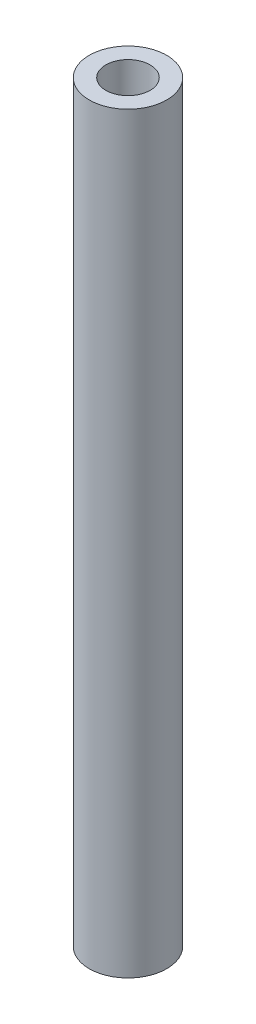
ISO-10303-21;
HEADER;
FILE_DESCRIPTION(('STEP AP214'),'2;1');
FILE_NAME('part.step','',(''),(''),'','','');
FILE_SCHEMA(('AUTOMOTIVE_DESIGN { 1 0 10303 214 1 1 1 1 }'));
ENDSEC;
DATA;
#1=APPLICATION_CONTEXT('core data for automotive mechanical design processes');
#2=APPLICATION_PROTOCOL_DEFINITION('international standard','automotive_design',2000,#1);
#3=PRODUCT_CONTEXT('',#1,'mechanical');
#4=PRODUCT('Part','Part','',(#3));
#5=PRODUCT_RELATED_PRODUCT_CATEGORY('part','',(#4));
#6=PRODUCT_DEFINITION_FORMATION('','',#4);
#7=PRODUCT_DEFINITION_CONTEXT('part definition',#1,'design');
#8=PRODUCT_DEFINITION('design','',#6,#7);
#9=PRODUCT_DEFINITION_SHAPE('','',#8);
#10=(LENGTH_UNIT() NAMED_UNIT(*) SI_UNIT(.MILLI.,.METRE.));
#11=(NAMED_UNIT(*) PLANE_ANGLE_UNIT() SI_UNIT($,.RADIAN.));
#12=(NAMED_UNIT(*) SI_UNIT($,.STERADIAN.) SOLID_ANGLE_UNIT());
#13=UNCERTAINTY_MEASURE_WITH_UNIT(LENGTH_MEASURE(1.E-05),#10,'distance_accuracy_value','');
#14=(GEOMETRIC_REPRESENTATION_CONTEXT(3) GLOBAL_UNCERTAINTY_ASSIGNED_CONTEXT((#13)) GLOBAL_UNIT_ASSIGNED_CONTEXT((#10,
#11,#12)) REPRESENTATION_CONTEXT('',''));
#15=CARTESIAN_POINT('',(0.,0.,0.));
#16=DIRECTION('',(0.,0.,1.));
#17=DIRECTION('',(1.,0.,0.));
#18=AXIS2_PLACEMENT_3D('',#15,#16,#17);
#19=CARTESIAN_POINT('',(0.,136.,0.));
#20=DIRECTION('',(0.,1.,0.));
#21=DIRECTION('',(0.,0.,1.));
#22=AXIS2_PLACEMENT_3D('',#19,#20,#21);
#23=PLANE('',#22);
#24=CARTESIAN_POINT('',(0.,136.,0.));
#25=DIRECTION('',(0.,1.,0.));
#26=DIRECTION('',(0.,0.,1.));
#27=AXIS2_PLACEMENT_3D('',#24,#25,#26);
#28=CIRCLE('',#27,7.);
#29=CARTESIAN_POINT('',(0.,136.,7.));
#30=VERTEX_POINT('',#29);
#31=EDGE_CURVE('E10',#30,#30,#28,.T.);
#32=ORIENTED_EDGE('',*,*,#31,.T.);
#33=EDGE_LOOP('',(#32));
#34=FACE_BOUND('',#33,.T.);
#35=CARTESIAN_POINT('',(0.,136.,0.));
#36=DIRECTION('',(0.,1.,0.));
#37=DIRECTION('',(0.,0.,1.));
#38=AXIS2_PLACEMENT_3D('',#35,#36,#37);
#39=CIRCLE('',#38,4.);
#40=CARTESIAN_POINT('',(0.,136.,4.));
#41=VERTEX_POINT('',#40);
#42=EDGE_CURVE('E44',#41,#41,#39,.T.);
#43=ORIENTED_EDGE('',*,*,#42,.F.);
#44=EDGE_LOOP('',(#43));
#45=FACE_BOUND('',#44,.T.);
#46=ADVANCED_FACE('F33',(#34,#45),#23,.T.);
#47=CARTESIAN_POINT('',(0.,0.,0.));
#48=DIRECTION('',(0.,1.,0.));
#49=DIRECTION('',(0.,0.,1.));
#50=AXIS2_PLACEMENT_3D('',#47,#48,#49);
#51=PLANE('',#50);
#52=CARTESIAN_POINT('',(0.,0.,0.));
#53=DIRECTION('',(0.,1.,0.));
#54=DIRECTION('',(0.,0.,1.));
#55=AXIS2_PLACEMENT_3D('',#52,#53,#54);
#56=CIRCLE('',#55,7.);
#57=CARTESIAN_POINT('',(0.,0.,7.));
#58=VERTEX_POINT('',#57);
#59=EDGE_CURVE('E37',#58,#58,#56,.T.);
#60=ORIENTED_EDGE('',*,*,#59,.F.);
#61=EDGE_LOOP('',(#60));
#62=FACE_BOUND('',#61,.T.);
#63=CARTESIAN_POINT('',(0.,0.,0.));
#64=DIRECTION('',(0.,1.,0.));
#65=DIRECTION('',(0.,0.,1.));
#66=AXIS2_PLACEMENT_3D('',#63,#64,#65);
#67=CIRCLE('',#66,4.);
#68=CARTESIAN_POINT('',(0.,0.,4.));
#69=VERTEX_POINT('',#68);
#70=EDGE_CURVE('E46',#69,#69,#67,.T.);
#71=ORIENTED_EDGE('',*,*,#70,.T.);
#72=EDGE_LOOP('',(#71));
#73=FACE_BOUND('',#72,.T.);
#74=ADVANCED_FACE('F56',(#62,#73),#51,.F.);
#75=CARTESIAN_POINT('',(0.,136.,0.));
#76=DIRECTION('',(0.,-1.,0.));
#77=DIRECTION('',(0.,0.,-1.));
#78=AXIS2_PLACEMENT_3D('',#75,#76,#77);
#79=CYLINDRICAL_SURFACE('',#78,7.);
#80=ORIENTED_EDGE('',*,*,#31,.F.);
#81=EDGE_LOOP('',(#80));
#82=FACE_BOUND('',#81,.T.);
#83=ORIENTED_EDGE('',*,*,#59,.T.);
#84=EDGE_LOOP('',(#83));
#85=FACE_BOUND('',#84,.T.);
#86=ADVANCED_FACE('F35',(#82,#85),#79,.T.);
#87=CARTESIAN_POINT('',(0.,136.,0.));
#88=DIRECTION('',(0.,-1.,0.));
#89=DIRECTION('',(0.,0.,-1.));
#90=AXIS2_PLACEMENT_3D('',#87,#88,#89);
#91=CYLINDRICAL_SURFACE('',#90,4.);
#92=ORIENTED_EDGE('',*,*,#42,.T.);
#93=EDGE_LOOP('',(#92));
#94=FACE_BOUND('',#93,.T.);
#95=ORIENTED_EDGE('',*,*,#70,.F.);
#96=EDGE_LOOP('',(#95));
#97=FACE_BOUND('',#96,.T.);
#98=ADVANCED_FACE('F52',(#94,#97),#91,.F.);
#99=CLOSED_SHELL('',(#46,#74,#86,#98));
#100=MANIFOLD_SOLID_BREP('B2',#99);
#101=ADVANCED_BREP_SHAPE_REPRESENTATION('',(#18,#100),#14);
#102=SHAPE_DEFINITION_REPRESENTATION(#9,#101);
ENDSEC;
END-ISO-10303-21;
